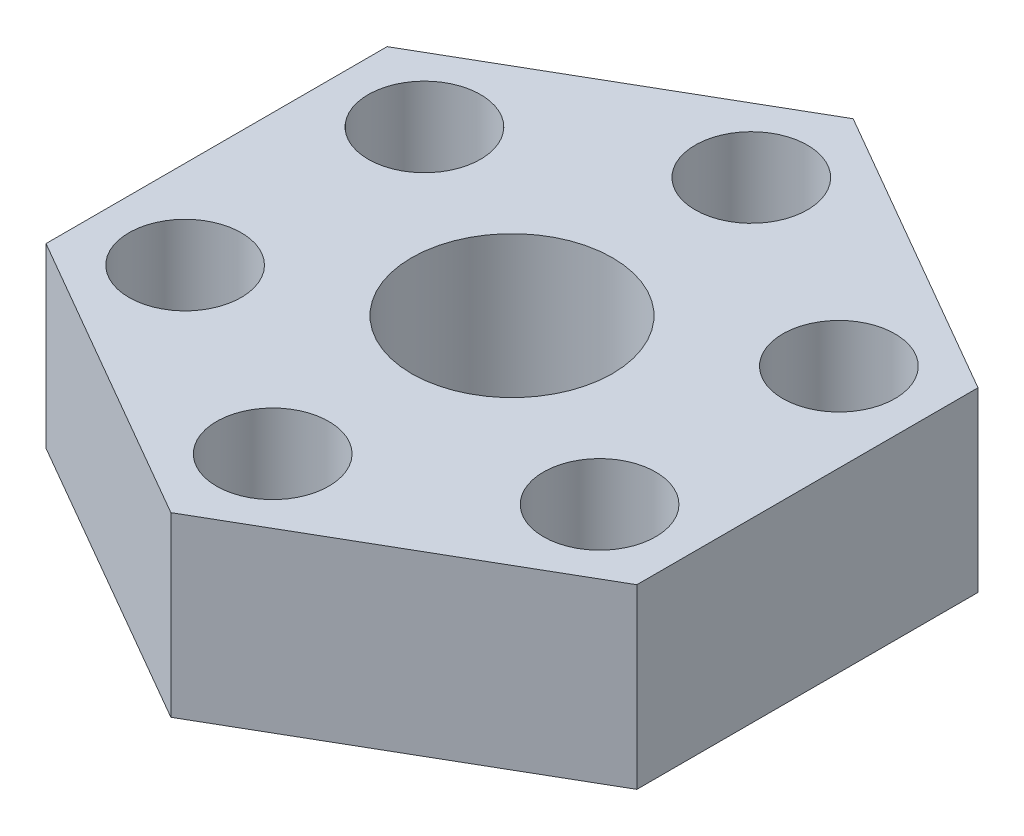
ISO-10303-21;
HEADER;
FILE_DESCRIPTION(('STEP AP214'),'2;1');
FILE_NAME('part.step','',(''),(''),'','','');
FILE_SCHEMA(('AUTOMOTIVE_DESIGN { 1 0 10303 214 1 1 1 1 }'));
ENDSEC;
DATA;
#1=APPLICATION_CONTEXT('core data for automotive mechanical design processes');
#2=APPLICATION_PROTOCOL_DEFINITION('international standard','automotive_design',2000,#1);
#3=PRODUCT_CONTEXT('',#1,'mechanical');
#4=PRODUCT('Part','Part','',(#3));
#5=PRODUCT_RELATED_PRODUCT_CATEGORY('part','',(#4));
#6=PRODUCT_DEFINITION_FORMATION('','',#4);
#7=PRODUCT_DEFINITION_CONTEXT('part definition',#1,'design');
#8=PRODUCT_DEFINITION('design','',#6,#7);
#9=PRODUCT_DEFINITION_SHAPE('','',#8);
#10=(LENGTH_UNIT() NAMED_UNIT(*) SI_UNIT(.MILLI.,.METRE.));
#11=(NAMED_UNIT(*) PLANE_ANGLE_UNIT() SI_UNIT($,.RADIAN.));
#12=(NAMED_UNIT(*) SI_UNIT($,.STERADIAN.) SOLID_ANGLE_UNIT());
#13=UNCERTAINTY_MEASURE_WITH_UNIT(LENGTH_MEASURE(1.E-05),#10,'distance_accuracy_value','');
#14=(GEOMETRIC_REPRESENTATION_CONTEXT(3) GLOBAL_UNCERTAINTY_ASSIGNED_CONTEXT((#13)) GLOBAL_UNIT_ASSIGNED_CONTEXT((#10,
#11,#12)) REPRESENTATION_CONTEXT('',''));
#15=CARTESIAN_POINT('',(0.,0.,0.));
#16=DIRECTION('',(0.,0.,1.));
#17=DIRECTION('',(1.,0.,0.));
#18=AXIS2_PLACEMENT_3D('',#15,#16,#17);
#19=CARTESIAN_POINT('',(0.,3.,0.));
#20=DIRECTION('',(0.,1.,0.));
#21=DIRECTION('',(0.,0.,1.));
#22=AXIS2_PLACEMENT_3D('',#19,#20,#21);
#23=PLANE('',#22);
#24=CARTESIAN_POINT('',(0.,3.,4.05));
#25=DIRECTION('',(0.,1.,0.));
#26=DIRECTION('',(0.,0.,1.));
#27=AXIS2_PLACEMENT_3D('',#24,#25,#26);
#28=CIRCLE('',#27,0.95);
#29=CARTESIAN_POINT('',(0.,3.,5.));
#30=VERTEX_POINT('',#29);
#31=EDGE_CURVE('E201',#30,#30,#28,.T.);
#32=ORIENTED_EDGE('',*,*,#31,.F.);
#33=EDGE_LOOP('',(#32));
#34=FACE_BOUND('',#33,.T.);
#35=CARTESIAN_POINT('',(3.50740288532698,3.,-2.025));
#36=DIRECTION('',(0.,1.,0.));
#37=DIRECTION('',(0.,0.,1.));
#38=AXIS2_PLACEMENT_3D('',#35,#36,#37);
#39=CIRCLE('',#38,0.95);
#40=CARTESIAN_POINT('',(3.50740288532698,3.,-1.075));
#41=VERTEX_POINT('',#40);
#42=EDGE_CURVE('E213',#41,#41,#39,.T.);
#43=ORIENTED_EDGE('',*,*,#42,.F.);
#44=EDGE_LOOP('',(#43));
#45=FACE_BOUND('',#44,.T.);
#46=CARTESIAN_POINT('',(-3.50740288532698,3.,-2.025));
#47=DIRECTION('',(0.,1.,0.));
#48=DIRECTION('',(0.,0.,1.));
#49=AXIS2_PLACEMENT_3D('',#46,#47,#48);
#50=CIRCLE('',#49,0.95);
#51=CARTESIAN_POINT('',(-3.50740288532698,3.,-1.075));
#52=VERTEX_POINT('',#51);
#53=EDGE_CURVE('E225',#52,#52,#50,.T.);
#54=ORIENTED_EDGE('',*,*,#53,.F.);
#55=EDGE_LOOP('',(#54));
#56=FACE_BOUND('',#55,.T.);
#57=DIRECTION('',(0.,0.,1.));
#58=VECTOR('',#57,1.);
#59=CARTESIAN_POINT('',(-5.,3.,-2.88675134594813));
#60=LINE('',#59,#58);
#61=CARTESIAN_POINT('',(-5.,3.,-2.88675134594813));
#62=VERTEX_POINT('',#61);
#63=CARTESIAN_POINT('',(-5.,3.,2.88675134594813));
#64=VERTEX_POINT('',#63);
#65=EDGE_CURVE('E129',#62,#64,#60,.T.);
#66=ORIENTED_EDGE('',*,*,#65,.T.);
#67=DIRECTION('',(0.866025403784439,0.,0.5));
#68=VECTOR('',#67,1.);
#69=CARTESIAN_POINT('',(-5.,3.,2.88675134594813));
#70=LINE('',#69,#68);
#71=CARTESIAN_POINT('',(0.,3.,5.77350269189626));
#72=VERTEX_POINT('',#71);
#73=EDGE_CURVE('E87',#64,#72,#70,.T.);
#74=ORIENTED_EDGE('',*,*,#73,.T.);
#75=DIRECTION('',(0.866025403784439,0.,-0.5));
#76=VECTOR('',#75,1.);
#77=CARTESIAN_POINT('',(0.,3.,5.77350269189626));
#78=LINE('',#77,#76);
#79=CARTESIAN_POINT('',(5.,3.,2.88675134594813));
#80=VERTEX_POINT('',#79);
#81=EDGE_CURVE('E100',#72,#80,#78,.T.);
#82=ORIENTED_EDGE('',*,*,#81,.T.);
#83=DIRECTION('',(0.,0.,-1.));
#84=VECTOR('',#83,1.);
#85=CARTESIAN_POINT('',(5.,3.,2.88675134594813));
#86=LINE('',#85,#84);
#87=CARTESIAN_POINT('',(5.,3.,-2.88675134594813));
#88=VERTEX_POINT('',#87);
#89=EDGE_CURVE('E94',#80,#88,#86,.T.);
#90=ORIENTED_EDGE('',*,*,#89,.T.);
#91=DIRECTION('',(-0.866025403784439,0.,-0.5));
#92=VECTOR('',#91,1.);
#93=CARTESIAN_POINT('',(5.,3.,-2.88675134594813));
#94=LINE('',#93,#92);
#95=CARTESIAN_POINT('',(0.,3.,-5.77350269189626));
#96=VERTEX_POINT('',#95);
#97=EDGE_CURVE('E98',#88,#96,#94,.T.);
#98=ORIENTED_EDGE('',*,*,#97,.T.);
#99=DIRECTION('',(-0.866025403784438,0.,0.5));
#100=VECTOR('',#99,1.);
#101=CARTESIAN_POINT('',(0.,3.,-5.77350269189626));
#102=LINE('',#101,#100);
#103=EDGE_CURVE('E50',#96,#62,#102,.T.);
#104=ORIENTED_EDGE('',*,*,#103,.T.);
#105=EDGE_LOOP('',(#66,#74,#82,#90,#98,#104));
#106=FACE_BOUND('',#105,.T.);
#107=CARTESIAN_POINT('',(0.,3.,0.));
#108=DIRECTION('',(0.,1.,0.));
#109=DIRECTION('',(0.,0.,1.));
#110=AXIS2_PLACEMENT_3D('',#107,#108,#109);
#111=CIRCLE('',#110,1.7);
#112=CARTESIAN_POINT('',(0.,3.,1.7));
#113=VERTEX_POINT('',#112);
#114=EDGE_CURVE('E122',#113,#113,#111,.T.);
#115=ORIENTED_EDGE('',*,*,#114,.F.);
#116=EDGE_LOOP('',(#115));
#117=FACE_BOUND('',#116,.T.);
#118=CARTESIAN_POINT('',(0.,3.,-4.05));
#119=DIRECTION('',(0.,1.,0.));
#120=DIRECTION('',(0.,0.,1.));
#121=AXIS2_PLACEMENT_3D('',#118,#119,#120);
#122=CIRCLE('',#121,0.95);
#123=CARTESIAN_POINT('',(0.,3.,-3.1));
#124=VERTEX_POINT('',#123);
#125=EDGE_CURVE('E219',#124,#124,#122,.T.);
#126=ORIENTED_EDGE('',*,*,#125,.F.);
#127=EDGE_LOOP('',(#126));
#128=FACE_BOUND('',#127,.T.);
#129=CARTESIAN_POINT('',(3.50740288532698,3.,2.025));
#130=DIRECTION('',(0.,1.,0.));
#131=DIRECTION('',(0.,0.,1.));
#132=AXIS2_PLACEMENT_3D('',#129,#130,#131);
#133=CIRCLE('',#132,0.95);
#134=CARTESIAN_POINT('',(3.50740288532698,3.,2.975));
#135=VERTEX_POINT('',#134);
#136=EDGE_CURVE('E207',#135,#135,#133,.T.);
#137=ORIENTED_EDGE('',*,*,#136,.F.);
#138=EDGE_LOOP('',(#137));
#139=FACE_BOUND('',#138,.T.);
#140=CARTESIAN_POINT('',(-3.50740288532697,3.,2.025));
#141=DIRECTION('',(0.,1.,0.));
#142=DIRECTION('',(0.,0.,1.));
#143=AXIS2_PLACEMENT_3D('',#140,#141,#142);
#144=CIRCLE('',#143,0.95);
#145=CARTESIAN_POINT('',(-3.50740288532697,3.,2.975));
#146=VERTEX_POINT('',#145);
#147=EDGE_CURVE('E192',#146,#146,#144,.T.);
#148=ORIENTED_EDGE('',*,*,#147,.F.);
#149=EDGE_LOOP('',(#148));
#150=FACE_BOUND('',#149,.T.);
#151=ADVANCED_FACE('F33',(#34,#45,#56,#106,#117,#128,#139,#150),#23,.T.);
#152=CARTESIAN_POINT('',(0.,0.,0.));
#153=DIRECTION('',(0.,1.,0.));
#154=DIRECTION('',(0.,0.,1.));
#155=AXIS2_PLACEMENT_3D('',#152,#153,#154);
#156=PLANE('',#155);
#157=DIRECTION('',(0.,0.,1.));
#158=VECTOR('',#157,1.);
#159=CARTESIAN_POINT('',(-5.,0.,-2.88675134594813));
#160=LINE('',#159,#158);
#161=CARTESIAN_POINT('',(-5.,0.,-2.88675134594813));
#162=VERTEX_POINT('',#161);
#163=CARTESIAN_POINT('',(-5.,0.,2.88675134594813));
#164=VERTEX_POINT('',#163);
#165=EDGE_CURVE('E118',#162,#164,#160,.T.);
#166=ORIENTED_EDGE('',*,*,#165,.F.);
#167=DIRECTION('',(-0.866025403784438,0.,0.5));
#168=VECTOR('',#167,1.);
#169=CARTESIAN_POINT('',(0.,0.,-5.77350269189626));
#170=LINE('',#169,#168);
#171=CARTESIAN_POINT('',(0.,0.,-5.77350269189626));
#172=VERTEX_POINT('',#171);
#173=EDGE_CURVE('E79',#172,#162,#170,.T.);
#174=ORIENTED_EDGE('',*,*,#173,.F.);
#175=DIRECTION('',(-0.866025403784439,0.,-0.5));
#176=VECTOR('',#175,1.);
#177=CARTESIAN_POINT('',(5.,0.,-2.88675134594813));
#178=LINE('',#177,#176);
#179=CARTESIAN_POINT('',(5.,0.,-2.88675134594813));
#180=VERTEX_POINT('',#179);
#181=EDGE_CURVE('E73',#180,#172,#178,.T.);
#182=ORIENTED_EDGE('',*,*,#181,.F.);
#183=DIRECTION('',(0.,0.,-1.));
#184=VECTOR('',#183,1.);
#185=CARTESIAN_POINT('',(5.,0.,2.88675134594813));
#186=LINE('',#185,#184);
#187=CARTESIAN_POINT('',(5.,0.,2.88675134594813));
#188=VERTEX_POINT('',#187);
#189=EDGE_CURVE('E108',#188,#180,#186,.T.);
#190=ORIENTED_EDGE('',*,*,#189,.F.);
#191=DIRECTION('',(0.866025403784439,0.,-0.5));
#192=VECTOR('',#191,1.);
#193=CARTESIAN_POINT('',(0.,0.,5.77350269189626));
#194=LINE('',#193,#192);
#195=CARTESIAN_POINT('',(0.,0.,5.77350269189626));
#196=VERTEX_POINT('',#195);
#197=EDGE_CURVE('E124',#196,#188,#194,.T.);
#198=ORIENTED_EDGE('',*,*,#197,.F.);
#199=DIRECTION('',(0.866025403784439,0.,0.5));
#200=VECTOR('',#199,1.);
#201=CARTESIAN_POINT('',(-5.,0.,2.88675134594813));
#202=LINE('',#201,#200);
#203=EDGE_CURVE('E121',#164,#196,#202,.T.);
#204=ORIENTED_EDGE('',*,*,#203,.F.);
#205=EDGE_LOOP('',(#166,#174,#182,#190,#198,#204));
#206=FACE_BOUND('',#205,.T.);
#207=CARTESIAN_POINT('',(0.,0.,0.));
#208=DIRECTION('',(0.,1.,0.));
#209=DIRECTION('',(0.,0.,1.));
#210=AXIS2_PLACEMENT_3D('',#207,#208,#209);
#211=CIRCLE('',#210,1.7);
#212=CARTESIAN_POINT('',(0.,0.,1.7));
#213=VERTEX_POINT('',#212);
#214=EDGE_CURVE('E228',#213,#213,#211,.T.);
#215=ORIENTED_EDGE('',*,*,#214,.T.);
#216=EDGE_LOOP('',(#215));
#217=FACE_BOUND('',#216,.T.);
#218=CARTESIAN_POINT('',(-3.50740288532698,0.,-2.025));
#219=DIRECTION('',(0.,1.,0.));
#220=DIRECTION('',(0.,0.,1.));
#221=AXIS2_PLACEMENT_3D('',#218,#219,#220);
#222=CIRCLE('',#221,0.95);
#223=CARTESIAN_POINT('',(-3.50740288532698,0.,-1.075));
#224=VERTEX_POINT('',#223);
#225=EDGE_CURVE('E222',#224,#224,#222,.T.);
#226=ORIENTED_EDGE('',*,*,#225,.T.);
#227=EDGE_LOOP('',(#226));
#228=FACE_BOUND('',#227,.T.);
#229=CARTESIAN_POINT('',(0.,0.,-4.05));
#230=DIRECTION('',(0.,1.,0.));
#231=DIRECTION('',(0.,0.,1.));
#232=AXIS2_PLACEMENT_3D('',#229,#230,#231);
#233=CIRCLE('',#232,0.95);
#234=CARTESIAN_POINT('',(0.,0.,-3.1));
#235=VERTEX_POINT('',#234);
#236=EDGE_CURVE('E216',#235,#235,#233,.T.);
#237=ORIENTED_EDGE('',*,*,#236,.T.);
#238=EDGE_LOOP('',(#237));
#239=FACE_BOUND('',#238,.T.);
#240=CARTESIAN_POINT('',(3.50740288532698,0.,-2.025));
#241=DIRECTION('',(0.,1.,0.));
#242=DIRECTION('',(0.,0.,1.));
#243=AXIS2_PLACEMENT_3D('',#240,#241,#242);
#244=CIRCLE('',#243,0.95);
#245=CARTESIAN_POINT('',(3.50740288532698,0.,-1.075));
#246=VERTEX_POINT('',#245);
#247=EDGE_CURVE('E210',#246,#246,#244,.T.);
#248=ORIENTED_EDGE('',*,*,#247,.T.);
#249=EDGE_LOOP('',(#248));
#250=FACE_BOUND('',#249,.T.);
#251=CARTESIAN_POINT('',(3.50740288532698,0.,2.025));
#252=DIRECTION('',(0.,1.,0.));
#253=DIRECTION('',(0.,0.,1.));
#254=AXIS2_PLACEMENT_3D('',#251,#252,#253);
#255=CIRCLE('',#254,0.95);
#256=CARTESIAN_POINT('',(3.50740288532698,0.,2.975));
#257=VERTEX_POINT('',#256);
#258=EDGE_CURVE('E204',#257,#257,#255,.T.);
#259=ORIENTED_EDGE('',*,*,#258,.T.);
#260=EDGE_LOOP('',(#259));
#261=FACE_BOUND('',#260,.T.);
#262=CARTESIAN_POINT('',(0.,0.,4.05));
#263=DIRECTION('',(0.,1.,0.));
#264=DIRECTION('',(0.,0.,1.));
#265=AXIS2_PLACEMENT_3D('',#262,#263,#264);
#266=CIRCLE('',#265,0.95);
#267=CARTESIAN_POINT('',(0.,0.,5.));
#268=VERTEX_POINT('',#267);
#269=EDGE_CURVE('E198',#268,#268,#266,.T.);
#270=ORIENTED_EDGE('',*,*,#269,.T.);
#271=EDGE_LOOP('',(#270));
#272=FACE_BOUND('',#271,.T.);
#273=CARTESIAN_POINT('',(-3.50740288532697,0.,2.025));
#274=DIRECTION('',(0.,1.,0.));
#275=DIRECTION('',(0.,0.,1.));
#276=AXIS2_PLACEMENT_3D('',#273,#274,#275);
#277=CIRCLE('',#276,0.95);
#278=CARTESIAN_POINT('',(-3.50740288532697,0.,2.975));
#279=VERTEX_POINT('',#278);
#280=EDGE_CURVE('E195',#279,#279,#277,.T.);
#281=ORIENTED_EDGE('',*,*,#280,.T.);
#282=EDGE_LOOP('',(#281));
#283=FACE_BOUND('',#282,.T.);
#284=ADVANCED_FACE('F138',(#206,#217,#228,#239,#250,#261,#272,#283),#156,.F.);
#285=CARTESIAN_POINT('',(-5.,3.,-2.88675134594813));
#286=DIRECTION('',(1.,0.,0.));
#287=DIRECTION('',(0.,0.,-1.));
#288=AXIS2_PLACEMENT_3D('',#285,#286,#287);
#289=PLANE('',#288);
#290=ORIENTED_EDGE('',*,*,#165,.T.);
#291=DIRECTION('',(0.,-1.,0.));
#292=VECTOR('',#291,1.);
#293=CARTESIAN_POINT('',(-5.,3.,2.88675134594813));
#294=LINE('',#293,#292);
#295=EDGE_CURVE('E11',#64,#164,#294,.T.);
#296=ORIENTED_EDGE('',*,*,#295,.F.);
#297=ORIENTED_EDGE('',*,*,#65,.F.);
#298=DIRECTION('',(0.,-1.,0.));
#299=VECTOR('',#298,1.);
#300=CARTESIAN_POINT('',(-5.,3.,-2.88675134594813));
#301=LINE('',#300,#299);
#302=EDGE_CURVE('E114',#62,#162,#301,.T.);
#303=ORIENTED_EDGE('',*,*,#302,.T.);
#304=EDGE_LOOP('',(#290,#296,#297,#303));
#305=FACE_BOUND('',#304,.T.);
#306=ADVANCED_FACE('F35',(#305),#289,.F.);
#307=CARTESIAN_POINT('',(-5.,3.,2.88675134594813));
#308=DIRECTION('',(0.5,0.,-0.866025403784439));
#309=DIRECTION('',(-0.866025403784439,0.,-0.5));
#310=AXIS2_PLACEMENT_3D('',#307,#308,#309);
#311=PLANE('',#310);
#312=ORIENTED_EDGE('',*,*,#203,.T.);
#313=DIRECTION('',(0.,-1.,0.));
#314=VECTOR('',#313,1.);
#315=CARTESIAN_POINT('',(0.,3.,5.77350269189626));
#316=LINE('',#315,#314);
#317=EDGE_CURVE('E42',#72,#196,#316,.T.);
#318=ORIENTED_EDGE('',*,*,#317,.F.);
#319=ORIENTED_EDGE('',*,*,#73,.F.);
#320=ORIENTED_EDGE('',*,*,#295,.T.);
#321=EDGE_LOOP('',(#312,#318,#319,#320));
#322=FACE_BOUND('',#321,.T.);
#323=ADVANCED_FACE('F313',(#322),#311,.F.);
#324=CARTESIAN_POINT('',(0.,3.,5.77350269189626));
#325=DIRECTION('',(-0.5,0.,-0.866025403784439));
#326=DIRECTION('',(-0.866025403784439,0.,0.5));
#327=AXIS2_PLACEMENT_3D('',#324,#325,#326);
#328=PLANE('',#327);
#329=ORIENTED_EDGE('',*,*,#197,.T.);
#330=DIRECTION('',(0.,-1.,0.));
#331=VECTOR('',#330,1.);
#332=CARTESIAN_POINT('',(5.,3.,2.88675134594813));
#333=LINE('',#332,#331);
#334=EDGE_CURVE('E109',#80,#188,#333,.T.);
#335=ORIENTED_EDGE('',*,*,#334,.F.);
#336=ORIENTED_EDGE('',*,*,#81,.F.);
#337=ORIENTED_EDGE('',*,*,#317,.T.);
#338=EDGE_LOOP('',(#329,#335,#336,#337));
#339=FACE_BOUND('',#338,.T.);
#340=ADVANCED_FACE('F135',(#339),#328,.F.);
#341=CARTESIAN_POINT('',(5.,3.,2.88675134594813));
#342=DIRECTION('',(-1.,0.,0.));
#343=DIRECTION('',(0.,0.,1.));
#344=AXIS2_PLACEMENT_3D('',#341,#342,#343);
#345=PLANE('',#344);
#346=ORIENTED_EDGE('',*,*,#189,.T.);
#347=DIRECTION('',(0.,-1.,0.));
#348=VECTOR('',#347,1.);
#349=CARTESIAN_POINT('',(5.,3.,-2.88675134594813));
#350=LINE('',#349,#348);
#351=EDGE_CURVE('E105',#88,#180,#350,.T.);
#352=ORIENTED_EDGE('',*,*,#351,.F.);
#353=ORIENTED_EDGE('',*,*,#89,.F.);
#354=ORIENTED_EDGE('',*,*,#334,.T.);
#355=EDGE_LOOP('',(#346,#352,#353,#354));
#356=FACE_BOUND('',#355,.T.);
#357=ADVANCED_FACE('F106',(#356),#345,.F.);
#358=CARTESIAN_POINT('',(5.,3.,-2.88675134594813));
#359=DIRECTION('',(-0.5,0.,0.866025403784439));
#360=DIRECTION('',(0.866025403784439,0.,0.5));
#361=AXIS2_PLACEMENT_3D('',#358,#359,#360);
#362=PLANE('',#361);
#363=ORIENTED_EDGE('',*,*,#181,.T.);
#364=DIRECTION('',(0.,-1.,0.));
#365=VECTOR('',#364,1.);
#366=CARTESIAN_POINT('',(0.,3.,-5.77350269189626));
#367=LINE('',#366,#365);
#368=EDGE_CURVE('E110',#96,#172,#367,.T.);
#369=ORIENTED_EDGE('',*,*,#368,.F.);
#370=ORIENTED_EDGE('',*,*,#97,.F.);
#371=ORIENTED_EDGE('',*,*,#351,.T.);
#372=EDGE_LOOP('',(#363,#369,#370,#371));
#373=FACE_BOUND('',#372,.T.);
#374=ADVANCED_FACE('F112',(#373),#362,.F.);
#375=CARTESIAN_POINT('',(0.,3.,-5.77350269189626));
#376=DIRECTION('',(0.5,0.,0.866025403784439));
#377=DIRECTION('',(0.866025403784439,0.,-0.5));
#378=AXIS2_PLACEMENT_3D('',#375,#376,#377);
#379=PLANE('',#378);
#380=ORIENTED_EDGE('',*,*,#173,.T.);
#381=ORIENTED_EDGE('',*,*,#302,.F.);
#382=ORIENTED_EDGE('',*,*,#103,.F.);
#383=ORIENTED_EDGE('',*,*,#368,.T.);
#384=EDGE_LOOP('',(#380,#381,#382,#383));
#385=FACE_BOUND('',#384,.T.);
#386=ADVANCED_FACE('F143',(#385),#379,.F.);
#387=CARTESIAN_POINT('',(0.,3.,0.));
#388=DIRECTION('',(0.,-1.,0.));
#389=DIRECTION('',(0.,0.,-1.));
#390=AXIS2_PLACEMENT_3D('',#387,#388,#389);
#391=CYLINDRICAL_SURFACE('',#390,1.7);
#392=ORIENTED_EDGE('',*,*,#114,.T.);
#393=EDGE_LOOP('',(#392));
#394=FACE_BOUND('',#393,.T.);
#395=ORIENTED_EDGE('',*,*,#214,.F.);
#396=EDGE_LOOP('',(#395));
#397=FACE_BOUND('',#396,.T.);
#398=ADVANCED_FACE('F145',(#394,#397),#391,.F.);
#399=CARTESIAN_POINT('',(-3.50740288532698,3.,-2.025));
#400=DIRECTION('',(0.,-1.,0.));
#401=DIRECTION('',(0.,0.,-1.));
#402=AXIS2_PLACEMENT_3D('',#399,#400,#401);
#403=CYLINDRICAL_SURFACE('',#402,0.95);
#404=ORIENTED_EDGE('',*,*,#53,.T.);
#405=EDGE_LOOP('',(#404));
#406=FACE_BOUND('',#405,.T.);
#407=ORIENTED_EDGE('',*,*,#225,.F.);
#408=EDGE_LOOP('',(#407));
#409=FACE_BOUND('',#408,.T.);
#410=ADVANCED_FACE('F151',(#406,#409),#403,.F.);
#411=CARTESIAN_POINT('',(0.,3.,-4.05));
#412=DIRECTION('',(0.,-1.,0.));
#413=DIRECTION('',(0.,0.,-1.));
#414=AXIS2_PLACEMENT_3D('',#411,#412,#413);
#415=CYLINDRICAL_SURFACE('',#414,0.95);
#416=ORIENTED_EDGE('',*,*,#125,.T.);
#417=EDGE_LOOP('',(#416));
#418=FACE_BOUND('',#417,.T.);
#419=ORIENTED_EDGE('',*,*,#236,.F.);
#420=EDGE_LOOP('',(#419));
#421=FACE_BOUND('',#420,.T.);
#422=ADVANCED_FACE('F167',(#418,#421),#415,.F.);
#423=CARTESIAN_POINT('',(3.50740288532698,3.,-2.025));
#424=DIRECTION('',(0.,-1.,0.));
#425=DIRECTION('',(0.,0.,-1.));
#426=AXIS2_PLACEMENT_3D('',#423,#424,#425);
#427=CYLINDRICAL_SURFACE('',#426,0.95);
#428=ORIENTED_EDGE('',*,*,#42,.T.);
#429=EDGE_LOOP('',(#428));
#430=FACE_BOUND('',#429,.T.);
#431=ORIENTED_EDGE('',*,*,#247,.F.);
#432=EDGE_LOOP('',(#431));
#433=FACE_BOUND('',#432,.T.);
#434=ADVANCED_FACE('F171',(#430,#433),#427,.F.);
#435=CARTESIAN_POINT('',(3.50740288532698,3.,2.025));
#436=DIRECTION('',(0.,-1.,0.));
#437=DIRECTION('',(0.,0.,-1.));
#438=AXIS2_PLACEMENT_3D('',#435,#436,#437);
#439=CYLINDRICAL_SURFACE('',#438,0.95);
#440=ORIENTED_EDGE('',*,*,#136,.T.);
#441=EDGE_LOOP('',(#440));
#442=FACE_BOUND('',#441,.T.);
#443=ORIENTED_EDGE('',*,*,#258,.F.);
#444=EDGE_LOOP('',(#443));
#445=FACE_BOUND('',#444,.T.);
#446=ADVANCED_FACE('F175',(#442,#445),#439,.F.);
#447=CARTESIAN_POINT('',(0.,3.,4.05));
#448=DIRECTION('',(0.,-1.,0.));
#449=DIRECTION('',(0.,0.,-1.));
#450=AXIS2_PLACEMENT_3D('',#447,#448,#449);
#451=CYLINDRICAL_SURFACE('',#450,0.95);
#452=ORIENTED_EDGE('',*,*,#31,.T.);
#453=EDGE_LOOP('',(#452));
#454=FACE_BOUND('',#453,.T.);
#455=ORIENTED_EDGE('',*,*,#269,.F.);
#456=EDGE_LOOP('',(#455));
#457=FACE_BOUND('',#456,.T.);
#458=ADVANCED_FACE('F179',(#454,#457),#451,.F.);
#459=CARTESIAN_POINT('',(-3.50740288532697,3.,2.025));
#460=DIRECTION('',(0.,-1.,0.));
#461=DIRECTION('',(0.,0.,-1.));
#462=AXIS2_PLACEMENT_3D('',#459,#460,#461);
#463=CYLINDRICAL_SURFACE('',#462,0.95);
#464=ORIENTED_EDGE('',*,*,#147,.T.);
#465=EDGE_LOOP('',(#464));
#466=FACE_BOUND('',#465,.T.);
#467=ORIENTED_EDGE('',*,*,#280,.F.);
#468=EDGE_LOOP('',(#467));
#469=FACE_BOUND('',#468,.T.);
#470=ADVANCED_FACE('F183',(#466,#469),#463,.F.);
#471=CLOSED_SHELL('',(#151,#284,#306,#323,#340,#357,#374,#386,#398,#410,#422,#434,#446,#458,#470));
#472=MANIFOLD_SOLID_BREP('B2',#471);
#473=ADVANCED_BREP_SHAPE_REPRESENTATION('',(#18,#472),#14);
#474=SHAPE_DEFINITION_REPRESENTATION(#9,#473);
ENDSEC;
END-ISO-10303-21;
